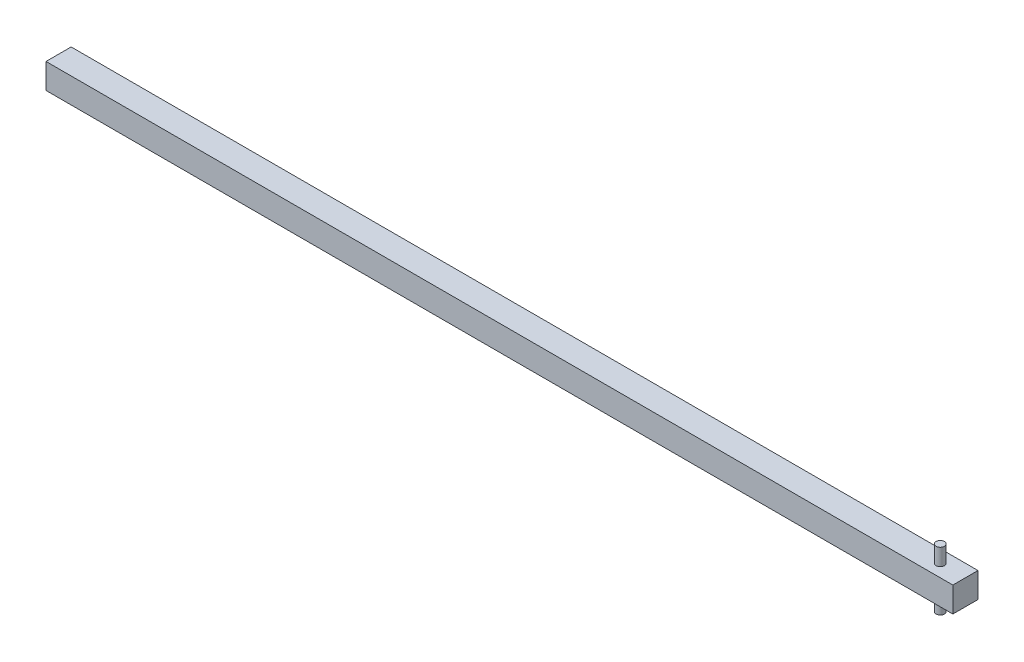
ISO-10303-21;
HEADER;
FILE_DESCRIPTION(('STEP AP214'),'2;1');
FILE_NAME('part.step','',(''),(''),'','','');
FILE_SCHEMA(('AUTOMOTIVE_DESIGN { 1 0 10303 214 1 1 1 1 }'));
ENDSEC;
DATA;
#1=APPLICATION_CONTEXT('core data for automotive mechanical design processes');
#2=APPLICATION_PROTOCOL_DEFINITION('international standard','automotive_design',2000,#1);
#3=PRODUCT_CONTEXT('',#1,'mechanical');
#4=PRODUCT('Part','Part','',(#3));
#5=PRODUCT_RELATED_PRODUCT_CATEGORY('part','',(#4));
#6=PRODUCT_DEFINITION_FORMATION('','',#4);
#7=PRODUCT_DEFINITION_CONTEXT('part definition',#1,'design');
#8=PRODUCT_DEFINITION('design','',#6,#7);
#9=PRODUCT_DEFINITION_SHAPE('','',#8);
#10=(LENGTH_UNIT() NAMED_UNIT(*) SI_UNIT(.MILLI.,.METRE.));
#11=(NAMED_UNIT(*) PLANE_ANGLE_UNIT() SI_UNIT($,.RADIAN.));
#12=(NAMED_UNIT(*) SI_UNIT($,.STERADIAN.) SOLID_ANGLE_UNIT());
#13=UNCERTAINTY_MEASURE_WITH_UNIT(LENGTH_MEASURE(1.E-05),#10,'distance_accuracy_value','');
#14=(GEOMETRIC_REPRESENTATION_CONTEXT(3) GLOBAL_UNCERTAINTY_ASSIGNED_CONTEXT((#13)) GLOBAL_UNIT_ASSIGNED_CONTEXT((#10,
#11,#12)) REPRESENTATION_CONTEXT('',''));
#15=CARTESIAN_POINT('',(0.,0.,0.));
#16=DIRECTION('',(0.,0.,1.));
#17=DIRECTION('',(1.,0.,0.));
#18=AXIS2_PLACEMENT_3D('',#15,#16,#17);
#19=CARTESIAN_POINT('',(160.,-2.5,-2.5));
#20=DIRECTION('',(0.,-1.,0.));
#21=DIRECTION('',(0.,0.,-1.));
#22=AXIS2_PLACEMENT_3D('',#19,#20,#21);
#23=PLANE('',#22);
#24=CARTESIAN_POINT('',(155.,-2.5,0.));
#25=DIRECTION('',(0.,1.,0.));
#26=DIRECTION('',(0.,0.,-1.));
#27=AXIS2_PLACEMENT_3D('',#24,#25,#26);
#28=CIRCLE('',#27,0.835);
#29=CARTESIAN_POINT('',(155.,-2.5,-0.835));
#30=VERTEX_POINT('',#29);
#31=EDGE_CURVE('E53',#30,#30,#28,.T.);
#32=ORIENTED_EDGE('',*,*,#31,.T.);
#33=EDGE_LOOP('',(#32));
#34=FACE_BOUND('',#33,.T.);
#35=DIRECTION('',(-1.,0.,0.));
#36=VECTOR('',#35,1.);
#37=CARTESIAN_POINT('',(160.,-2.5,2.5));
#38=LINE('',#37,#36);
#39=CARTESIAN_POINT('',(160.,-2.5,2.5));
#40=VERTEX_POINT('',#39);
#41=CARTESIAN_POINT('',(-20.3,-2.5,2.5));
#42=VERTEX_POINT('',#41);
#43=EDGE_CURVE('E130',#40,#42,#38,.T.);
#44=ORIENTED_EDGE('',*,*,#43,.T.);
#45=DIRECTION('',(0.,0.,1.));
#46=VECTOR('',#45,1.);
#47=CARTESIAN_POINT('',(-20.3,-2.5,-2.5));
#48=LINE('',#47,#46);
#49=CARTESIAN_POINT('',(-20.3,-2.5,-2.5));
#50=VERTEX_POINT('',#49);
#51=EDGE_CURVE('E120',#50,#42,#48,.T.);
#52=ORIENTED_EDGE('',*,*,#51,.F.);
#53=DIRECTION('',(-1.,0.,0.));
#54=VECTOR('',#53,1.);
#55=CARTESIAN_POINT('',(160.,-2.5,-2.5));
#56=LINE('',#55,#54);
#57=CARTESIAN_POINT('',(160.,-2.5,-2.5));
#58=VERTEX_POINT('',#57);
#59=EDGE_CURVE('E127',#58,#50,#56,.T.);
#60=ORIENTED_EDGE('',*,*,#59,.F.);
#61=DIRECTION('',(0.,0.,1.));
#62=VECTOR('',#61,1.);
#63=CARTESIAN_POINT('',(160.,-2.5,-2.5));
#64=LINE('',#63,#62);
#65=EDGE_CURVE('E11',#58,#40,#64,.T.);
#66=ORIENTED_EDGE('',*,*,#65,.T.);
#67=EDGE_LOOP('',(#44,#52,#60,#66));
#68=FACE_BOUND('',#67,.T.);
#69=ADVANCED_FACE('F49',(#34,#68),#23,.T.);
#70=CARTESIAN_POINT('',(160.,-2.5,2.5));
#71=DIRECTION('',(0.,0.,1.));
#72=DIRECTION('',(1.,0.,0.));
#73=AXIS2_PLACEMENT_3D('',#70,#71,#72);
#74=PLANE('',#73);
#75=DIRECTION('',(-1.,0.,0.));
#76=VECTOR('',#75,1.);
#77=CARTESIAN_POINT('',(160.,2.5,2.5));
#78=LINE('',#77,#76);
#79=CARTESIAN_POINT('',(160.,2.5,2.5));
#80=VERTEX_POINT('',#79);
#81=CARTESIAN_POINT('',(-20.3,2.5,2.5));
#82=VERTEX_POINT('',#81);
#83=EDGE_CURVE('E137',#80,#82,#78,.T.);
#84=ORIENTED_EDGE('',*,*,#83,.T.);
#85=DIRECTION('',(0.,1.,0.));
#86=VECTOR('',#85,1.);
#87=CARTESIAN_POINT('',(-20.3,-2.5,2.5));
#88=LINE('',#87,#86);
#89=EDGE_CURVE('E131',#42,#82,#88,.T.);
#90=ORIENTED_EDGE('',*,*,#89,.F.);
#91=ORIENTED_EDGE('',*,*,#43,.F.);
#92=DIRECTION('',(0.,1.,0.));
#93=VECTOR('',#92,1.);
#94=CARTESIAN_POINT('',(160.,-2.5,2.5));
#95=LINE('',#94,#93);
#96=EDGE_CURVE('E59',#40,#80,#95,.T.);
#97=ORIENTED_EDGE('',*,*,#96,.T.);
#98=EDGE_LOOP('',(#84,#90,#91,#97));
#99=FACE_BOUND('',#98,.T.);
#100=ADVANCED_FACE('F175',(#99),#74,.T.);
#101=CARTESIAN_POINT('',(160.,2.5,-2.5));
#102=DIRECTION('',(0.,-1.,0.));
#103=DIRECTION('',(0.,0.,-1.));
#104=AXIS2_PLACEMENT_3D('',#101,#102,#103);
#105=PLANE('',#104);
#106=CARTESIAN_POINT('',(155.,2.5,0.));
#107=DIRECTION('',(0.,1.,0.));
#108=DIRECTION('',(0.,0.,-1.));
#109=AXIS2_PLACEMENT_3D('',#106,#107,#108);
#110=CIRCLE('',#109,0.835);
#111=CARTESIAN_POINT('',(155.,2.5,-0.835));
#112=VERTEX_POINT('',#111);
#113=EDGE_CURVE('E163',#112,#112,#110,.T.);
#114=ORIENTED_EDGE('',*,*,#113,.F.);
#115=EDGE_LOOP('',(#114));
#116=FACE_BOUND('',#115,.T.);
#117=DIRECTION('',(0.,0.,-1.));
#118=VECTOR('',#117,1.);
#119=CARTESIAN_POINT('',(-20.3,2.5,2.5));
#120=LINE('',#119,#118);
#121=CARTESIAN_POINT('',(-20.3,2.5,-2.5));
#122=VERTEX_POINT('',#121);
#123=EDGE_CURVE('E66',#82,#122,#120,.T.);
#124=ORIENTED_EDGE('',*,*,#123,.F.);
#125=ORIENTED_EDGE('',*,*,#83,.F.);
#126=DIRECTION('',(0.,0.,1.));
#127=VECTOR('',#126,1.);
#128=CARTESIAN_POINT('',(160.,2.5,-2.5));
#129=LINE('',#128,#127);
#130=CARTESIAN_POINT('',(160.,2.5,-2.5));
#131=VERTEX_POINT('',#130);
#132=EDGE_CURVE('E143',#131,#80,#129,.T.);
#133=ORIENTED_EDGE('',*,*,#132,.F.);
#134=DIRECTION('',(-1.,0.,0.));
#135=VECTOR('',#134,1.);
#136=CARTESIAN_POINT('',(160.,2.5,-2.5));
#137=LINE('',#136,#135);
#138=EDGE_CURVE('E146',#131,#122,#137,.T.);
#139=ORIENTED_EDGE('',*,*,#138,.T.);
#140=EDGE_LOOP('',(#124,#125,#133,#139));
#141=FACE_BOUND('',#140,.T.);
#142=ADVANCED_FACE('F51',(#116,#141),#105,.F.);
#143=CARTESIAN_POINT('',(160.,-2.5,-2.5));
#144=DIRECTION('',(0.,0.,1.));
#145=DIRECTION('',(1.,0.,0.));
#146=AXIS2_PLACEMENT_3D('',#143,#144,#145);
#147=PLANE('',#146);
#148=DIRECTION('',(0.,-1.,0.));
#149=VECTOR('',#148,1.);
#150=CARTESIAN_POINT('',(-20.3,2.5,-2.5));
#151=LINE('',#150,#149);
#152=EDGE_CURVE('E117',#122,#50,#151,.T.);
#153=ORIENTED_EDGE('',*,*,#152,.F.);
#154=ORIENTED_EDGE('',*,*,#138,.F.);
#155=DIRECTION('',(0.,1.,0.));
#156=VECTOR('',#155,1.);
#157=CARTESIAN_POINT('',(160.,-2.5,-2.5));
#158=LINE('',#157,#156);
#159=EDGE_CURVE('E135',#58,#131,#158,.T.);
#160=ORIENTED_EDGE('',*,*,#159,.F.);
#161=ORIENTED_EDGE('',*,*,#59,.T.);
#162=EDGE_LOOP('',(#153,#154,#160,#161));
#163=FACE_BOUND('',#162,.T.);
#164=ADVANCED_FACE('F133',(#163),#147,.F.);
#165=CARTESIAN_POINT('',(155.,5.835,0.));
#166=DIRECTION('',(0.,1.,0.));
#167=DIRECTION('',(1.,0.,0.));
#168=AXIS2_PLACEMENT_3D('',#165,#166,#167);
#169=PLANE('',#168);
#170=CARTESIAN_POINT('',(155.,5.835,0.));
#171=DIRECTION('',(0.,1.,0.));
#172=DIRECTION('',(0.,0.,1.));
#173=AXIS2_PLACEMENT_3D('',#170,#171,#172);
#174=CIRCLE('',#173,0.835);
#175=CARTESIAN_POINT('',(155.,5.835,-0.835));
#176=VERTEX_POINT('',#175);
#177=EDGE_CURVE('E166',#176,#176,#174,.T.);
#178=ORIENTED_EDGE('',*,*,#177,.T.);
#179=EDGE_LOOP('',(#178));
#180=FACE_BOUND('',#179,.T.);
#181=ADVANCED_FACE('F189',(#180),#169,.T.);
#182=CARTESIAN_POINT('',(155.,-5.835,0.));
#183=DIRECTION('',(0.,1.,0.));
#184=DIRECTION('',(1.,0.,0.));
#185=AXIS2_PLACEMENT_3D('',#182,#183,#184);
#186=PLANE('',#185);
#187=CARTESIAN_POINT('',(155.,-5.835,0.));
#188=DIRECTION('',(0.,1.,0.));
#189=DIRECTION('',(0.,0.,1.));
#190=AXIS2_PLACEMENT_3D('',#187,#188,#189);
#191=CIRCLE('',#190,0.835);
#192=CARTESIAN_POINT('',(155.,-5.835,-0.835));
#193=VERTEX_POINT('',#192);
#194=EDGE_CURVE('E110',#193,#193,#191,.T.);
#195=ORIENTED_EDGE('',*,*,#194,.F.);
#196=EDGE_LOOP('',(#195));
#197=FACE_BOUND('',#196,.T.);
#198=ADVANCED_FACE('F180',(#197),#186,.F.);
#199=CARTESIAN_POINT('',(160.,0.,0.));
#200=DIRECTION('',(1.,0.,0.));
#201=DIRECTION('',(0.,1.,0.));
#202=AXIS2_PLACEMENT_3D('',#199,#200,#201);
#203=PLANE('',#202);
#204=ORIENTED_EDGE('',*,*,#159,.T.);
#205=ORIENTED_EDGE('',*,*,#132,.T.);
#206=ORIENTED_EDGE('',*,*,#96,.F.);
#207=ORIENTED_EDGE('',*,*,#65,.F.);
#208=EDGE_LOOP('',(#204,#205,#206,#207));
#209=FACE_BOUND('',#208,.T.);
#210=ADVANCED_FACE('F176',(#209),#203,.T.);
#211=CARTESIAN_POINT('',(155.,5.835,0.));
#212=DIRECTION('',(0.,-1.,0.));
#213=DIRECTION('',(0.,0.,-1.));
#214=AXIS2_PLACEMENT_3D('',#211,#212,#213);
#215=CYLINDRICAL_SURFACE('',#214,0.835);
#216=ORIENTED_EDGE('',*,*,#194,.T.);
#217=EDGE_LOOP('',(#216));
#218=FACE_BOUND('',#217,.T.);
#219=ORIENTED_EDGE('',*,*,#31,.F.);
#220=EDGE_LOOP('',(#219));
#221=FACE_BOUND('',#220,.T.);
#222=ADVANCED_FACE('F179',(#218,#221),#215,.T.);
#223=CARTESIAN_POINT('',(155.,5.835,0.));
#224=DIRECTION('',(0.,-1.,0.));
#225=DIRECTION('',(0.,0.,-1.));
#226=AXIS2_PLACEMENT_3D('',#223,#224,#225);
#227=CYLINDRICAL_SURFACE('',#226,0.835);
#228=ORIENTED_EDGE('',*,*,#113,.T.);
#229=EDGE_LOOP('',(#228));
#230=FACE_BOUND('',#229,.T.);
#231=ORIENTED_EDGE('',*,*,#177,.F.);
#232=EDGE_LOOP('',(#231));
#233=FACE_BOUND('',#232,.T.);
#234=ADVANCED_FACE('F187',(#230,#233),#227,.T.);
#235=CARTESIAN_POINT('',(-20.3,0.,0.));
#236=DIRECTION('',(-1.,0.,0.));
#237=DIRECTION('',(0.,0.,1.));
#238=AXIS2_PLACEMENT_3D('',#235,#236,#237);
#239=PLANE('',#238);
#240=ORIENTED_EDGE('',*,*,#123,.T.);
#241=ORIENTED_EDGE('',*,*,#152,.T.);
#242=ORIENTED_EDGE('',*,*,#51,.T.);
#243=ORIENTED_EDGE('',*,*,#89,.T.);
#244=EDGE_LOOP('',(#240,#241,#242,#243));
#245=FACE_BOUND('',#244,.T.);
#246=ADVANCED_FACE('F119',(#245),#239,.T.);
#247=CLOSED_SHELL('',(#69,#100,#142,#164,#181,#198,#210,#222,#234,#246));
#248=MANIFOLD_SOLID_BREP('B2',#247);
#249=ADVANCED_BREP_SHAPE_REPRESENTATION('',(#18,#248),#14);
#250=SHAPE_DEFINITION_REPRESENTATION(#9,#249);
ENDSEC;
END-ISO-10303-21;
